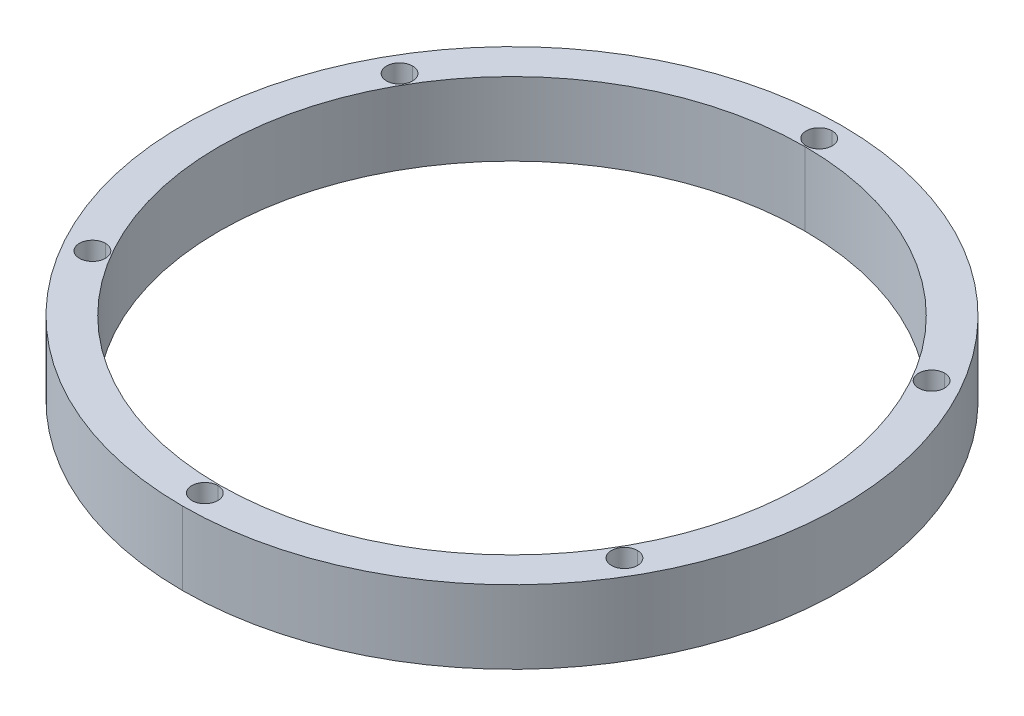
ISO-10303-21;
HEADER;
FILE_DESCRIPTION(('STEP AP214'),'2;1');
FILE_NAME('part.step','',(''),(''),'','','');
FILE_SCHEMA(('AUTOMOTIVE_DESIGN { 1 0 10303 214 1 1 1 1 }'));
ENDSEC;
DATA;
#1=APPLICATION_CONTEXT('core data for automotive mechanical design processes');
#2=APPLICATION_PROTOCOL_DEFINITION('international standard','automotive_design',2000,#1);
#3=PRODUCT_CONTEXT('',#1,'mechanical');
#4=PRODUCT('Part','Part','',(#3));
#5=PRODUCT_RELATED_PRODUCT_CATEGORY('part','',(#4));
#6=PRODUCT_DEFINITION_FORMATION('','',#4);
#7=PRODUCT_DEFINITION_CONTEXT('part definition',#1,'design');
#8=PRODUCT_DEFINITION('design','',#6,#7);
#9=PRODUCT_DEFINITION_SHAPE('','',#8);
#10=(LENGTH_UNIT() NAMED_UNIT(*) SI_UNIT(.MILLI.,.METRE.));
#11=(NAMED_UNIT(*) PLANE_ANGLE_UNIT() SI_UNIT($,.RADIAN.));
#12=(NAMED_UNIT(*) SI_UNIT($,.STERADIAN.) SOLID_ANGLE_UNIT());
#13=UNCERTAINTY_MEASURE_WITH_UNIT(LENGTH_MEASURE(1.E-05),#10,'distance_accuracy_value','');
#14=(GEOMETRIC_REPRESENTATION_CONTEXT(3) GLOBAL_UNCERTAINTY_ASSIGNED_CONTEXT((#13)) GLOBAL_UNIT_ASSIGNED_CONTEXT((#10,
#11,#12)) REPRESENTATION_CONTEXT('',''));
#15=CARTESIAN_POINT('',(0.,0.,0.));
#16=DIRECTION('',(0.,0.,1.));
#17=DIRECTION('',(1.,0.,0.));
#18=AXIS2_PLACEMENT_3D('',#15,#16,#17);
#19=CARTESIAN_POINT('',(-32.6924589928615,9.,-18.8749999999981));
#20=DIRECTION('',(0.,-1.,0.));
#21=DIRECTION('',(0.,0.,-1.));
#22=AXIS2_PLACEMENT_3D('',#19,#20,#21);
#23=CYLINDRICAL_SURFACE('',#22,1.60000000000201);
#24=DIRECTION('',(0.,-1.,0.));
#25=VECTOR('',#24,1.);
#26=CARTESIAN_POINT('',(-32.6924589928615,9.,-17.2749999999961));
#27=LINE('',#26,#25);
#28=CARTESIAN_POINT('',(-32.6924589928615,9.,-17.2749999999961));
#29=VERTEX_POINT('',#28);
#30=CARTESIAN_POINT('',(-32.6924589928615,0.,-17.2749999999961));
#31=VERTEX_POINT('',#30);
#32=EDGE_CURVE('E200',#29,#31,#27,.T.);
#33=ORIENTED_EDGE('',*,*,#32,.F.);
#34=CARTESIAN_POINT('',(-32.6924589928615,9.,-18.8749999999981));
#35=DIRECTION('',(0.,1.,0.));
#36=DIRECTION('',(0.,0.,1.));
#37=AXIS2_PLACEMENT_3D('',#34,#35,#36);
#38=CIRCLE('',#37,1.60000000000201);
#39=CARTESIAN_POINT('',(-32.6924589928615,9.,-20.475));
#40=VERTEX_POINT('',#39);
#41=EDGE_CURVE('E174',#29,#40,#38,.T.);
#42=ORIENTED_EDGE('',*,*,#41,.T.);
#43=DIRECTION('',(0.,-1.,0.));
#44=VECTOR('',#43,1.);
#45=CARTESIAN_POINT('',(-32.6924589928615,9.,-20.475));
#46=LINE('',#45,#44);
#47=CARTESIAN_POINT('',(-32.6924589928615,0.,-20.475));
#48=VERTEX_POINT('',#47);
#49=EDGE_CURVE('E226',#40,#48,#46,.T.);
#50=ORIENTED_EDGE('',*,*,#49,.T.);
#51=CARTESIAN_POINT('',(-32.6924589928615,0.,-18.8749999999981));
#52=DIRECTION('',(0.,1.,0.));
#53=DIRECTION('',(0.,0.,1.));
#54=AXIS2_PLACEMENT_3D('',#51,#52,#53);
#55=CIRCLE('',#54,1.60000000000201);
#56=EDGE_CURVE('E11',#31,#48,#55,.T.);
#57=ORIENTED_EDGE('',*,*,#56,.F.);
#58=EDGE_LOOP('',(#33,#42,#50,#57));
#59=FACE_BOUND('',#58,.T.);
#60=ADVANCED_FACE('F17',(#59),#23,.F.);
#61=CARTESIAN_POINT('',(-32.6924589928594,9.,18.8750000000018));
#62=DIRECTION('',(0.,-1.,0.));
#63=DIRECTION('',(0.,0.,-1.));
#64=AXIS2_PLACEMENT_3D('',#61,#62,#63);
#65=CYLINDRICAL_SURFACE('',#64,1.60000000000396);
#66=DIRECTION('',(0.,-1.,0.));
#67=VECTOR('',#66,1.);
#68=CARTESIAN_POINT('',(-32.6924589928594,9.,20.4750000000058));
#69=LINE('',#68,#67);
#70=CARTESIAN_POINT('',(-32.6924589928594,9.,20.4750000000058));
#71=VERTEX_POINT('',#70);
#72=CARTESIAN_POINT('',(-32.6924589928594,0.,20.4750000000058));
#73=VERTEX_POINT('',#72);
#74=EDGE_CURVE('E225',#71,#73,#69,.T.);
#75=ORIENTED_EDGE('',*,*,#74,.F.);
#76=CARTESIAN_POINT('',(-32.6924589928594,9.,18.8750000000018));
#77=DIRECTION('',(0.,1.,0.));
#78=DIRECTION('',(0.,0.,1.));
#79=AXIS2_PLACEMENT_3D('',#76,#77,#78);
#80=CIRCLE('',#79,1.60000000000396);
#81=CARTESIAN_POINT('',(-32.6924589928594,9.,17.2749999999979));
#82=VERTEX_POINT('',#81);
#83=EDGE_CURVE('E268',#71,#82,#80,.T.);
#84=ORIENTED_EDGE('',*,*,#83,.T.);
#85=DIRECTION('',(0.,-1.,0.));
#86=VECTOR('',#85,1.);
#87=CARTESIAN_POINT('',(-32.6924589928594,9.,17.2749999999979));
#88=LINE('',#87,#86);
#89=CARTESIAN_POINT('',(-32.6924589928594,0.,17.2749999999979));
#90=VERTEX_POINT('',#89);
#91=EDGE_CURVE('E190',#82,#90,#88,.T.);
#92=ORIENTED_EDGE('',*,*,#91,.T.);
#93=CARTESIAN_POINT('',(-32.6924589928594,0.,18.8750000000018));
#94=DIRECTION('',(0.,1.,0.));
#95=DIRECTION('',(0.,0.,1.));
#96=AXIS2_PLACEMENT_3D('',#93,#94,#95);
#97=CIRCLE('',#96,1.60000000000396);
#98=EDGE_CURVE('E28',#73,#90,#97,.T.);
#99=ORIENTED_EDGE('',*,*,#98,.F.);
#100=EDGE_LOOP('',(#75,#84,#92,#99));
#101=FACE_BOUND('',#100,.T.);
#102=ADVANCED_FACE('F404',(#101),#65,.F.);
#103=CARTESIAN_POINT('',(4.27780899899066E-12,9.,37.75));
#104=DIRECTION('',(0.,-1.,0.));
#105=DIRECTION('',(0.,0.,-1.));
#106=AXIS2_PLACEMENT_3D('',#103,#104,#105);
#107=CYLINDRICAL_SURFACE('',#106,1.60000000000434);
#108=DIRECTION('',(0.,-1.,0.));
#109=VECTOR('',#108,1.);
#110=CARTESIAN_POINT('',(4.27800494247853E-12,9.,39.3500000000044));
#111=LINE('',#110,#109);
#112=CARTESIAN_POINT('',(4.27800494247853E-12,9.,39.3500000000044));
#113=VERTEX_POINT('',#112);
#114=CARTESIAN_POINT('',(4.27800494247853E-12,0.,39.3500000000044));
#115=VERTEX_POINT('',#114);
#116=EDGE_CURVE('E178',#113,#115,#111,.T.);
#117=ORIENTED_EDGE('',*,*,#116,.F.);
#118=CARTESIAN_POINT('',(4.27780899899066E-12,9.,37.75));
#119=DIRECTION('',(0.,1.,0.));
#120=DIRECTION('',(0.,0.,1.));
#121=AXIS2_PLACEMENT_3D('',#118,#119,#120);
#122=CIRCLE('',#121,1.60000000000434);
#123=CARTESIAN_POINT('',(4.27780899899066E-12,9.,36.1499999999957));
#124=VERTEX_POINT('',#123);
#125=EDGE_CURVE('E164',#113,#124,#122,.T.);
#126=ORIENTED_EDGE('',*,*,#125,.T.);
#127=DIRECTION('',(0.,-1.,0.));
#128=VECTOR('',#127,1.);
#129=CARTESIAN_POINT('',(4.27780899899066E-12,9.,36.1499999999957));
#130=LINE('',#129,#128);
#131=CARTESIAN_POINT('',(4.27780899899066E-12,0.,36.1499999999957));
#132=VERTEX_POINT('',#131);
#133=EDGE_CURVE('E188',#124,#132,#130,.T.);
#134=ORIENTED_EDGE('',*,*,#133,.T.);
#135=CARTESIAN_POINT('',(4.27780899899066E-12,0.,37.75));
#136=DIRECTION('',(0.,1.,0.));
#137=DIRECTION('',(0.,0.,1.));
#138=AXIS2_PLACEMENT_3D('',#135,#136,#137);
#139=CIRCLE('',#138,1.60000000000434);
#140=EDGE_CURVE('E180',#115,#132,#139,.T.);
#141=ORIENTED_EDGE('',*,*,#140,.F.);
#142=EDGE_LOOP('',(#117,#126,#134,#141));
#143=FACE_BOUND('',#142,.T.);
#144=ADVANCED_FACE('F179',(#143),#107,.F.);
#145=CARTESIAN_POINT('',(32.6924589928657,9.,18.8749999999981));
#146=DIRECTION('',(0.,-1.,0.));
#147=DIRECTION('',(0.,0.,-1.));
#148=AXIS2_PLACEMENT_3D('',#145,#146,#147);
#149=CYLINDRICAL_SURFACE('',#148,1.60000000000271);
#150=DIRECTION('',(0.,-1.,0.));
#151=VECTOR('',#150,1.);
#152=CARTESIAN_POINT('',(32.6924589928657,9.,20.4750000000009));
#153=LINE('',#152,#151);
#154=CARTESIAN_POINT('',(32.6924589928657,9.,20.4750000000009));
#155=VERTEX_POINT('',#154);
#156=CARTESIAN_POINT('',(32.6924589928657,0.,20.4750000000009));
#157=VERTEX_POINT('',#156);
#158=EDGE_CURVE('E287',#155,#157,#153,.T.);
#159=ORIENTED_EDGE('',*,*,#158,.F.);
#160=CARTESIAN_POINT('',(32.6924589928657,9.,18.8749999999981));
#161=DIRECTION('',(0.,1.,0.));
#162=DIRECTION('',(0.,0.,1.));
#163=AXIS2_PLACEMENT_3D('',#160,#161,#162);
#164=CIRCLE('',#163,1.60000000000271);
#165=CARTESIAN_POINT('',(32.6924589928657,9.,17.2749999999955));
#166=VERTEX_POINT('',#165);
#167=EDGE_CURVE('E277',#155,#166,#164,.T.);
#168=ORIENTED_EDGE('',*,*,#167,.T.);
#169=DIRECTION('',(0.,-1.,0.));
#170=VECTOR('',#169,1.);
#171=CARTESIAN_POINT('',(32.6924589928657,9.,17.2749999999955));
#172=LINE('',#171,#170);
#173=CARTESIAN_POINT('',(32.6924589928657,0.,17.2749999999955));
#174=VERTEX_POINT('',#173);
#175=EDGE_CURVE('E241',#166,#174,#172,.T.);
#176=ORIENTED_EDGE('',*,*,#175,.T.);
#177=CARTESIAN_POINT('',(32.6924589928657,0.,18.8749999999981));
#178=DIRECTION('',(0.,1.,0.));
#179=DIRECTION('',(0.,0.,1.));
#180=AXIS2_PLACEMENT_3D('',#177,#178,#179);
#181=CIRCLE('',#180,1.60000000000271);
#182=EDGE_CURVE('E308',#157,#174,#181,.T.);
#183=ORIENTED_EDGE('',*,*,#182,.F.);
#184=EDGE_LOOP('',(#159,#168,#176,#183));
#185=FACE_BOUND('',#184,.T.);
#186=ADVANCED_FACE('F416',(#185),#149,.F.);
#187=CARTESIAN_POINT('',(32.6924589928636,9.,-18.8750000000018));
#188=DIRECTION('',(0.,-1.,0.));
#189=DIRECTION('',(0.,0.,-1.));
#190=AXIS2_PLACEMENT_3D('',#187,#188,#189);
#191=CYLINDRICAL_SURFACE('',#190,1.60000000000058);
#192=DIRECTION('',(0.,-1.,0.));
#193=VECTOR('',#192,1.);
#194=CARTESIAN_POINT('',(32.6924589928636,9.,-17.2750000000013));
#195=LINE('',#194,#193);
#196=CARTESIAN_POINT('',(32.6924589928636,9.,-17.2750000000013));
#197=VERTEX_POINT('',#196);
#198=CARTESIAN_POINT('',(32.6924589928636,0.,-17.2750000000013));
#199=VERTEX_POINT('',#198);
#200=EDGE_CURVE('E202',#197,#199,#195,.T.);
#201=ORIENTED_EDGE('',*,*,#200,.F.);
#202=CARTESIAN_POINT('',(32.6924589928636,9.,-18.8750000000018));
#203=DIRECTION('',(0.,1.,0.));
#204=DIRECTION('',(0.,0.,1.));
#205=AXIS2_PLACEMENT_3D('',#202,#203,#204);
#206=CIRCLE('',#205,1.60000000000058);
#207=CARTESIAN_POINT('',(32.6924589928636,9.,-20.4750000000024));
#208=VERTEX_POINT('',#207);
#209=EDGE_CURVE('E175',#197,#208,#206,.T.);
#210=ORIENTED_EDGE('',*,*,#209,.T.);
#211=DIRECTION('',(0.,-1.,0.));
#212=VECTOR('',#211,1.);
#213=CARTESIAN_POINT('',(32.6924589928636,9.,-20.4750000000024));
#214=LINE('',#213,#212);
#215=CARTESIAN_POINT('',(32.6924589928636,0.,-20.4750000000024));
#216=VERTEX_POINT('',#215);
#217=EDGE_CURVE('E208',#208,#216,#214,.T.);
#218=ORIENTED_EDGE('',*,*,#217,.T.);
#219=CARTESIAN_POINT('',(32.6924589928636,0.,-18.8750000000018));
#220=DIRECTION('',(0.,1.,0.));
#221=DIRECTION('',(0.,0.,1.));
#222=AXIS2_PLACEMENT_3D('',#219,#220,#221);
#223=CIRCLE('',#222,1.60000000000058);
#224=EDGE_CURVE('E311',#199,#216,#223,.T.);
#225=ORIENTED_EDGE('',*,*,#224,.F.);
#226=EDGE_LOOP('',(#201,#210,#218,#225));
#227=FACE_BOUND('',#226,.T.);
#228=ADVANCED_FACE('F371',(#227),#191,.F.);
#229=CARTESIAN_POINT('',(0.,9.,-37.75));
#230=DIRECTION('',(0.,-1.,0.));
#231=DIRECTION('',(0.,0.,-1.));
#232=AXIS2_PLACEMENT_3D('',#229,#230,#231);
#233=CYLINDRICAL_SURFACE('',#232,1.6);
#234=DIRECTION('',(0.,-1.,0.));
#235=VECTOR('',#234,1.);
#236=CARTESIAN_POINT('',(0.,9.,-36.15));
#237=LINE('',#236,#235);
#238=CARTESIAN_POINT('',(0.,9.,-36.15));
#239=VERTEX_POINT('',#238);
#240=CARTESIAN_POINT('',(0.,0.,-36.15));
#241=VERTEX_POINT('',#240);
#242=EDGE_CURVE('E213',#239,#241,#237,.T.);
#243=ORIENTED_EDGE('',*,*,#242,.F.);
#244=CARTESIAN_POINT('',(0.,9.,-37.75));
#245=DIRECTION('',(0.,1.,0.));
#246=DIRECTION('',(0.,0.,1.));
#247=AXIS2_PLACEMENT_3D('',#244,#245,#246);
#248=CIRCLE('',#247,1.6);
#249=CARTESIAN_POINT('',(0.,9.,-39.35));
#250=VERTEX_POINT('',#249);
#251=EDGE_CURVE('E21',#239,#250,#248,.T.);
#252=ORIENTED_EDGE('',*,*,#251,.T.);
#253=DIRECTION('',(0.,-1.,0.));
#254=VECTOR('',#253,1.);
#255=CARTESIAN_POINT('',(0.,9.,-39.35));
#256=LINE('',#255,#254);
#257=CARTESIAN_POINT('',(0.,0.,-39.35));
#258=VERTEX_POINT('',#257);
#259=EDGE_CURVE('E253',#250,#258,#256,.T.);
#260=ORIENTED_EDGE('',*,*,#259,.T.);
#261=CARTESIAN_POINT('',(0.,0.,-37.75));
#262=DIRECTION('',(0.,1.,0.));
#263=DIRECTION('',(0.,0.,1.));
#264=AXIS2_PLACEMENT_3D('',#261,#262,#263);
#265=CIRCLE('',#264,1.6);
#266=EDGE_CURVE('E294',#241,#258,#265,.T.);
#267=ORIENTED_EDGE('',*,*,#266,.F.);
#268=EDGE_LOOP('',(#243,#252,#260,#267));
#269=FACE_BOUND('',#268,.T.);
#270=ADVANCED_FACE('F423',(#269),#233,.F.);
#271=CARTESIAN_POINT('',(0.,9.,0.));
#272=DIRECTION('',(0.,-1.,0.));
#273=DIRECTION('',(0.,0.,-1.));
#274=AXIS2_PLACEMENT_3D('',#271,#272,#273);
#275=CYLINDRICAL_SURFACE('',#274,36.);
#276=DIRECTION('',(0.,-1.,0.));
#277=VECTOR('',#276,1.);
#278=CARTESIAN_POINT('',(0.,9.,36.));
#279=LINE('',#278,#277);
#280=CARTESIAN_POINT('',(0.,9.,36.));
#281=VERTEX_POINT('',#280);
#282=CARTESIAN_POINT('',(0.,0.,36.));
#283=VERTEX_POINT('',#282);
#284=EDGE_CURVE('E246',#281,#283,#279,.T.);
#285=ORIENTED_EDGE('',*,*,#284,.F.);
#286=CARTESIAN_POINT('',(0.,9.,0.));
#287=DIRECTION('',(0.,1.,0.));
#288=DIRECTION('',(0.,0.,1.));
#289=AXIS2_PLACEMENT_3D('',#286,#287,#288);
#290=CIRCLE('',#289,36.);
#291=CARTESIAN_POINT('',(0.,9.,-36.));
#292=VERTEX_POINT('',#291);
#293=EDGE_CURVE('E346',#281,#292,#290,.T.);
#294=ORIENTED_EDGE('',*,*,#293,.T.);
#295=DIRECTION('',(0.,-1.,0.));
#296=VECTOR('',#295,1.);
#297=CARTESIAN_POINT('',(0.,9.,-36.));
#298=LINE('',#297,#296);
#299=CARTESIAN_POINT('',(0.,0.,-36.));
#300=VERTEX_POINT('',#299);
#301=EDGE_CURVE('E245',#292,#300,#298,.T.);
#302=ORIENTED_EDGE('',*,*,#301,.T.);
#303=CARTESIAN_POINT('',(0.,0.,0.));
#304=DIRECTION('',(0.,1.,0.));
#305=DIRECTION('',(0.,0.,1.));
#306=AXIS2_PLACEMENT_3D('',#303,#304,#305);
#307=CIRCLE('',#306,36.);
#308=EDGE_CURVE('E220',#283,#300,#307,.T.);
#309=ORIENTED_EDGE('',*,*,#308,.F.);
#310=EDGE_LOOP('',(#285,#294,#302,#309));
#311=FACE_BOUND('',#310,.T.);
#312=ADVANCED_FACE('F401',(#311),#275,.F.);
#313=CARTESIAN_POINT('',(0.,9.,0.));
#314=DIRECTION('',(0.,-1.,0.));
#315=DIRECTION('',(0.,0.,-1.));
#316=AXIS2_PLACEMENT_3D('',#313,#314,#315);
#317=CYLINDRICAL_SURFACE('',#316,40.5);
#318=DIRECTION('',(0.,-1.,0.));
#319=VECTOR('',#318,1.);
#320=CARTESIAN_POINT('',(0.,9.,40.5));
#321=LINE('',#320,#319);
#322=CARTESIAN_POINT('',(0.,9.,40.5));
#323=VERTEX_POINT('',#322);
#324=CARTESIAN_POINT('',(0.,0.,40.5));
#325=VERTEX_POINT('',#324);
#326=EDGE_CURVE('E230',#323,#325,#321,.T.);
#327=ORIENTED_EDGE('',*,*,#326,.F.);
#328=CARTESIAN_POINT('',(0.,9.,0.));
#329=DIRECTION('',(0.,1.,0.));
#330=DIRECTION('',(0.,0.,1.));
#331=AXIS2_PLACEMENT_3D('',#328,#329,#330);
#332=CIRCLE('',#331,40.5);
#333=CARTESIAN_POINT('',(0.,9.,-40.5));
#334=VERTEX_POINT('',#333);
#335=EDGE_CURVE('E265',#334,#323,#332,.T.);
#336=ORIENTED_EDGE('',*,*,#335,.F.);
#337=DIRECTION('',(0.,-1.,0.));
#338=VECTOR('',#337,1.);
#339=CARTESIAN_POINT('',(0.,9.,-40.5));
#340=LINE('',#339,#338);
#341=CARTESIAN_POINT('',(0.,0.,-40.5));
#342=VERTEX_POINT('',#341);
#343=EDGE_CURVE('E269',#334,#342,#340,.T.);
#344=ORIENTED_EDGE('',*,*,#343,.T.);
#345=CARTESIAN_POINT('',(0.,0.,0.));
#346=DIRECTION('',(0.,1.,0.));
#347=DIRECTION('',(0.,0.,1.));
#348=AXIS2_PLACEMENT_3D('',#345,#346,#347);
#349=CIRCLE('',#348,40.5);
#350=EDGE_CURVE('E41',#342,#325,#349,.T.);
#351=ORIENTED_EDGE('',*,*,#350,.T.);
#352=EDGE_LOOP('',(#327,#336,#344,#351));
#353=FACE_BOUND('',#352,.T.);
#354=ADVANCED_FACE('F391',(#353),#317,.T.);
#355=CARTESIAN_POINT('',(0.,0.,0.));
#356=DIRECTION('',(0.,1.,0.));
#357=DIRECTION('',(1.,0.,0.));
#358=AXIS2_PLACEMENT_3D('',#355,#356,#357);
#359=PLANE('',#358);
#360=CARTESIAN_POINT('',(-32.6924589928615,0.,-18.8749999999981));
#361=DIRECTION('',(0.,1.,0.));
#362=DIRECTION('',(0.,0.,1.));
#363=AXIS2_PLACEMENT_3D('',#360,#361,#362);
#364=CIRCLE('',#363,1.60000000000201);
#365=EDGE_CURVE('E295',#48,#31,#364,.T.);
#366=ORIENTED_EDGE('',*,*,#365,.T.);
#367=ORIENTED_EDGE('',*,*,#56,.T.);
#368=EDGE_LOOP('',(#366,#367));
#369=FACE_BOUND('',#368,.T.);
#370=CARTESIAN_POINT('',(-32.6924589928594,0.,18.8750000000018));
#371=DIRECTION('',(0.,1.,0.));
#372=DIRECTION('',(0.,0.,1.));
#373=AXIS2_PLACEMENT_3D('',#370,#371,#372);
#374=CIRCLE('',#373,1.60000000000396);
#375=EDGE_CURVE('E196',#90,#73,#374,.T.);
#376=ORIENTED_EDGE('',*,*,#375,.T.);
#377=ORIENTED_EDGE('',*,*,#98,.T.);
#378=EDGE_LOOP('',(#376,#377));
#379=FACE_BOUND('',#378,.T.);
#380=CARTESIAN_POINT('',(4.27780899899066E-12,0.,37.75));
#381=DIRECTION('',(0.,1.,0.));
#382=DIRECTION('',(0.,0.,1.));
#383=AXIS2_PLACEMENT_3D('',#380,#381,#382);
#384=CIRCLE('',#383,1.60000000000434);
#385=EDGE_CURVE('E185',#132,#115,#384,.T.);
#386=ORIENTED_EDGE('',*,*,#385,.T.);
#387=ORIENTED_EDGE('',*,*,#140,.T.);
#388=EDGE_LOOP('',(#386,#387));
#389=FACE_BOUND('',#388,.T.);
#390=CARTESIAN_POINT('',(32.6924589928657,0.,18.8749999999981));
#391=DIRECTION('',(0.,1.,0.));
#392=DIRECTION('',(0.,0.,1.));
#393=AXIS2_PLACEMENT_3D('',#390,#391,#392);
#394=CIRCLE('',#393,1.60000000000271);
#395=EDGE_CURVE('E261',#174,#157,#394,.T.);
#396=ORIENTED_EDGE('',*,*,#395,.T.);
#397=ORIENTED_EDGE('',*,*,#182,.T.);
#398=EDGE_LOOP('',(#396,#397));
#399=FACE_BOUND('',#398,.T.);
#400=CARTESIAN_POINT('',(32.6924589928636,0.,-18.8750000000018));
#401=DIRECTION('',(0.,1.,0.));
#402=DIRECTION('',(0.,0.,1.));
#403=AXIS2_PLACEMENT_3D('',#400,#401,#402);
#404=CIRCLE('',#403,1.60000000000058);
#405=EDGE_CURVE('E206',#216,#199,#404,.T.);
#406=ORIENTED_EDGE('',*,*,#405,.T.);
#407=ORIENTED_EDGE('',*,*,#224,.T.);
#408=EDGE_LOOP('',(#406,#407));
#409=FACE_BOUND('',#408,.T.);
#410=CARTESIAN_POINT('',(0.,0.,-37.75));
#411=DIRECTION('',(0.,1.,0.));
#412=DIRECTION('',(0.,0.,1.));
#413=AXIS2_PLACEMENT_3D('',#410,#411,#412);
#414=CIRCLE('',#413,1.6);
#415=EDGE_CURVE('E217',#258,#241,#414,.T.);
#416=ORIENTED_EDGE('',*,*,#415,.T.);
#417=ORIENTED_EDGE('',*,*,#266,.T.);
#418=EDGE_LOOP('',(#416,#417));
#419=FACE_BOUND('',#418,.T.);
#420=CARTESIAN_POINT('',(0.,0.,0.));
#421=DIRECTION('',(0.,1.,0.));
#422=DIRECTION('',(0.,0.,1.));
#423=AXIS2_PLACEMENT_3D('',#420,#421,#422);
#424=CIRCLE('',#423,36.);
#425=EDGE_CURVE('E242',#300,#283,#424,.T.);
#426=ORIENTED_EDGE('',*,*,#425,.T.);
#427=ORIENTED_EDGE('',*,*,#308,.T.);
#428=EDGE_LOOP('',(#426,#427));
#429=FACE_BOUND('',#428,.T.);
#430=ORIENTED_EDGE('',*,*,#350,.F.);
#431=CARTESIAN_POINT('',(0.,0.,0.));
#432=DIRECTION('',(0.,1.,0.));
#433=DIRECTION('',(0.,0.,1.));
#434=AXIS2_PLACEMENT_3D('',#431,#432,#433);
#435=CIRCLE('',#434,40.5);
#436=EDGE_CURVE('E233',#325,#342,#435,.T.);
#437=ORIENTED_EDGE('',*,*,#436,.F.);
#438=EDGE_LOOP('',(#430,#437));
#439=FACE_BOUND('',#438,.T.);
#440=ADVANCED_FACE('F366',(#369,#379,#389,#399,#409,#419,#429,#439),#359,.F.);
#441=CARTESIAN_POINT('',(0.,9.,0.));
#442=DIRECTION('',(0.,1.,0.));
#443=DIRECTION('',(1.,0.,0.));
#444=AXIS2_PLACEMENT_3D('',#441,#442,#443);
#445=PLANE('',#444);
#446=CARTESIAN_POINT('',(-32.6924589928615,9.,-18.8749999999981));
#447=DIRECTION('',(0.,1.,0.));
#448=DIRECTION('',(0.,0.,1.));
#449=AXIS2_PLACEMENT_3D('',#446,#447,#448);
#450=CIRCLE('',#449,1.60000000000201);
#451=EDGE_CURVE('E288',#40,#29,#450,.T.);
#452=ORIENTED_EDGE('',*,*,#451,.F.);
#453=ORIENTED_EDGE('',*,*,#41,.F.);
#454=EDGE_LOOP('',(#452,#453));
#455=FACE_BOUND('',#454,.T.);
#456=CARTESIAN_POINT('',(4.27780899899066E-12,9.,37.75));
#457=DIRECTION('',(0.,1.,0.));
#458=DIRECTION('',(0.,0.,1.));
#459=AXIS2_PLACEMENT_3D('',#456,#457,#458);
#460=CIRCLE('',#459,1.60000000000434);
#461=EDGE_CURVE('E169',#124,#113,#460,.T.);
#462=ORIENTED_EDGE('',*,*,#461,.F.);
#463=ORIENTED_EDGE('',*,*,#125,.F.);
#464=EDGE_LOOP('',(#462,#463));
#465=FACE_BOUND('',#464,.T.);
#466=CARTESIAN_POINT('',(32.6924589928636,9.,-18.8750000000018));
#467=DIRECTION('',(0.,1.,0.));
#468=DIRECTION('',(0.,0.,1.));
#469=AXIS2_PLACEMENT_3D('',#466,#467,#468);
#470=CIRCLE('',#469,1.60000000000058);
#471=EDGE_CURVE('E207',#208,#197,#470,.T.);
#472=ORIENTED_EDGE('',*,*,#471,.F.);
#473=ORIENTED_EDGE('',*,*,#209,.F.);
#474=EDGE_LOOP('',(#472,#473));
#475=FACE_BOUND('',#474,.T.);
#476=CARTESIAN_POINT('',(0.,9.,0.));
#477=DIRECTION('',(0.,1.,0.));
#478=DIRECTION('',(0.,0.,1.));
#479=AXIS2_PLACEMENT_3D('',#476,#477,#478);
#480=CIRCLE('',#479,36.);
#481=EDGE_CURVE('E257',#292,#281,#480,.T.);
#482=ORIENTED_EDGE('',*,*,#481,.F.);
#483=ORIENTED_EDGE('',*,*,#293,.F.);
#484=EDGE_LOOP('',(#482,#483));
#485=FACE_BOUND('',#484,.T.);
#486=CARTESIAN_POINT('',(0.,9.,-37.75));
#487=DIRECTION('',(0.,1.,0.));
#488=DIRECTION('',(0.,0.,1.));
#489=AXIS2_PLACEMENT_3D('',#486,#487,#488);
#490=CIRCLE('',#489,1.6);
#491=EDGE_CURVE('E212',#250,#239,#490,.T.);
#492=ORIENTED_EDGE('',*,*,#491,.F.);
#493=ORIENTED_EDGE('',*,*,#251,.F.);
#494=EDGE_LOOP('',(#492,#493));
#495=FACE_BOUND('',#494,.T.);
#496=CARTESIAN_POINT('',(32.6924589928657,9.,18.8749999999981));
#497=DIRECTION('',(0.,1.,0.));
#498=DIRECTION('',(0.,0.,1.));
#499=AXIS2_PLACEMENT_3D('',#496,#497,#498);
#500=CIRCLE('',#499,1.60000000000271);
#501=EDGE_CURVE('E283',#166,#155,#500,.T.);
#502=ORIENTED_EDGE('',*,*,#501,.F.);
#503=ORIENTED_EDGE('',*,*,#167,.F.);
#504=EDGE_LOOP('',(#502,#503));
#505=FACE_BOUND('',#504,.T.);
#506=CARTESIAN_POINT('',(-32.6924589928594,9.,18.8750000000018));
#507=DIRECTION('',(0.,1.,0.));
#508=DIRECTION('',(0.,0.,1.));
#509=AXIS2_PLACEMENT_3D('',#506,#507,#508);
#510=CIRCLE('',#509,1.60000000000396);
#511=EDGE_CURVE('E221',#82,#71,#510,.T.);
#512=ORIENTED_EDGE('',*,*,#511,.F.);
#513=ORIENTED_EDGE('',*,*,#83,.F.);
#514=EDGE_LOOP('',(#512,#513));
#515=FACE_BOUND('',#514,.T.);
#516=ORIENTED_EDGE('',*,*,#335,.T.);
#517=CARTESIAN_POINT('',(0.,9.,0.));
#518=DIRECTION('',(0.,1.,0.));
#519=DIRECTION('',(0.,0.,1.));
#520=AXIS2_PLACEMENT_3D('',#517,#518,#519);
#521=CIRCLE('',#520,40.5);
#522=EDGE_CURVE('E234',#323,#334,#521,.T.);
#523=ORIENTED_EDGE('',*,*,#522,.T.);
#524=EDGE_LOOP('',(#516,#523));
#525=FACE_BOUND('',#524,.T.);
#526=ADVANCED_FACE('F166',(#455,#465,#475,#485,#495,#505,#515,#525),#445,.T.);
#527=CARTESIAN_POINT('',(0.,9.,0.));
#528=DIRECTION('',(0.,-1.,0.));
#529=DIRECTION('',(0.,0.,-1.));
#530=AXIS2_PLACEMENT_3D('',#527,#528,#529);
#531=CYLINDRICAL_SURFACE('',#530,40.5);
#532=ORIENTED_EDGE('',*,*,#522,.F.);
#533=ORIENTED_EDGE('',*,*,#326,.T.);
#534=ORIENTED_EDGE('',*,*,#436,.T.);
#535=ORIENTED_EDGE('',*,*,#343,.F.);
#536=EDGE_LOOP('',(#532,#533,#534,#535));
#537=FACE_BOUND('',#536,.T.);
#538=ADVANCED_FACE('F377',(#537),#531,.T.);
#539=CARTESIAN_POINT('',(0.,9.,0.));
#540=DIRECTION('',(0.,-1.,0.));
#541=DIRECTION('',(0.,0.,-1.));
#542=AXIS2_PLACEMENT_3D('',#539,#540,#541);
#543=CYLINDRICAL_SURFACE('',#542,36.);
#544=ORIENTED_EDGE('',*,*,#481,.T.);
#545=ORIENTED_EDGE('',*,*,#284,.T.);
#546=ORIENTED_EDGE('',*,*,#425,.F.);
#547=ORIENTED_EDGE('',*,*,#301,.F.);
#548=EDGE_LOOP('',(#544,#545,#546,#547));
#549=FACE_BOUND('',#548,.T.);
#550=ADVANCED_FACE('F420',(#549),#543,.F.);
#551=CARTESIAN_POINT('',(0.,9.,-37.75));
#552=DIRECTION('',(0.,-1.,0.));
#553=DIRECTION('',(0.,0.,-1.));
#554=AXIS2_PLACEMENT_3D('',#551,#552,#553);
#555=CYLINDRICAL_SURFACE('',#554,1.6);
#556=ORIENTED_EDGE('',*,*,#491,.T.);
#557=ORIENTED_EDGE('',*,*,#242,.T.);
#558=ORIENTED_EDGE('',*,*,#415,.F.);
#559=ORIENTED_EDGE('',*,*,#259,.F.);
#560=EDGE_LOOP('',(#556,#557,#558,#559));
#561=FACE_BOUND('',#560,.T.);
#562=ADVANCED_FACE('F440',(#561),#555,.F.);
#563=CARTESIAN_POINT('',(32.6924589928636,9.,-18.8750000000018));
#564=DIRECTION('',(0.,-1.,0.));
#565=DIRECTION('',(0.,0.,-1.));
#566=AXIS2_PLACEMENT_3D('',#563,#564,#565);
#567=CYLINDRICAL_SURFACE('',#566,1.60000000000058);
#568=ORIENTED_EDGE('',*,*,#471,.T.);
#569=ORIENTED_EDGE('',*,*,#200,.T.);
#570=ORIENTED_EDGE('',*,*,#405,.F.);
#571=ORIENTED_EDGE('',*,*,#217,.F.);
#572=EDGE_LOOP('',(#568,#569,#570,#571));
#573=FACE_BOUND('',#572,.T.);
#574=ADVANCED_FACE('F374',(#573),#567,.F.);
#575=CARTESIAN_POINT('',(32.6924589928657,9.,18.8749999999981));
#576=DIRECTION('',(0.,-1.,0.));
#577=DIRECTION('',(0.,0.,-1.));
#578=AXIS2_PLACEMENT_3D('',#575,#576,#577);
#579=CYLINDRICAL_SURFACE('',#578,1.60000000000271);
#580=ORIENTED_EDGE('',*,*,#501,.T.);
#581=ORIENTED_EDGE('',*,*,#158,.T.);
#582=ORIENTED_EDGE('',*,*,#395,.F.);
#583=ORIENTED_EDGE('',*,*,#175,.F.);
#584=EDGE_LOOP('',(#580,#581,#582,#583));
#585=FACE_BOUND('',#584,.T.);
#586=ADVANCED_FACE('F19',(#585),#579,.F.);
#587=CARTESIAN_POINT('',(4.27780899899066E-12,9.,37.75));
#588=DIRECTION('',(0.,-1.,0.));
#589=DIRECTION('',(0.,0.,-1.));
#590=AXIS2_PLACEMENT_3D('',#587,#588,#589);
#591=CYLINDRICAL_SURFACE('',#590,1.60000000000434);
#592=ORIENTED_EDGE('',*,*,#461,.T.);
#593=ORIENTED_EDGE('',*,*,#116,.T.);
#594=ORIENTED_EDGE('',*,*,#385,.F.);
#595=ORIENTED_EDGE('',*,*,#133,.F.);
#596=EDGE_LOOP('',(#592,#593,#594,#595));
#597=FACE_BOUND('',#596,.T.);
#598=ADVANCED_FACE('F187',(#597),#591,.F.);
#599=CARTESIAN_POINT('',(-32.6924589928594,9.,18.8750000000018));
#600=DIRECTION('',(0.,-1.,0.));
#601=DIRECTION('',(0.,0.,-1.));
#602=AXIS2_PLACEMENT_3D('',#599,#600,#601);
#603=CYLINDRICAL_SURFACE('',#602,1.60000000000396);
#604=ORIENTED_EDGE('',*,*,#511,.T.);
#605=ORIENTED_EDGE('',*,*,#74,.T.);
#606=ORIENTED_EDGE('',*,*,#375,.F.);
#607=ORIENTED_EDGE('',*,*,#91,.F.);
#608=EDGE_LOOP('',(#604,#605,#606,#607));
#609=FACE_BOUND('',#608,.T.);
#610=ADVANCED_FACE('F427',(#609),#603,.F.);
#611=CARTESIAN_POINT('',(-32.6924589928615,9.,-18.8749999999981));
#612=DIRECTION('',(0.,-1.,0.));
#613=DIRECTION('',(0.,0.,-1.));
#614=AXIS2_PLACEMENT_3D('',#611,#612,#613);
#615=CYLINDRICAL_SURFACE('',#614,1.60000000000201);
#616=ORIENTED_EDGE('',*,*,#451,.T.);
#617=ORIENTED_EDGE('',*,*,#32,.T.);
#618=ORIENTED_EDGE('',*,*,#365,.F.);
#619=ORIENTED_EDGE('',*,*,#49,.F.);
#620=EDGE_LOOP('',(#616,#617,#618,#619));
#621=FACE_BOUND('',#620,.T.);
#622=ADVANCED_FACE('F433',(#621),#615,.F.);
#623=CLOSED_SHELL('',(#60,#102,#144,#186,#228,#270,#312,#354,#440,#526,#538,#550,#562,#574,#586,
#598,#610,#622));
#624=MANIFOLD_SOLID_BREP('B1',#623);
#625=ADVANCED_BREP_SHAPE_REPRESENTATION('',(#18,#624),#14);
#626=SHAPE_DEFINITION_REPRESENTATION(#9,#625);
ENDSEC;
END-ISO-10303-21;
